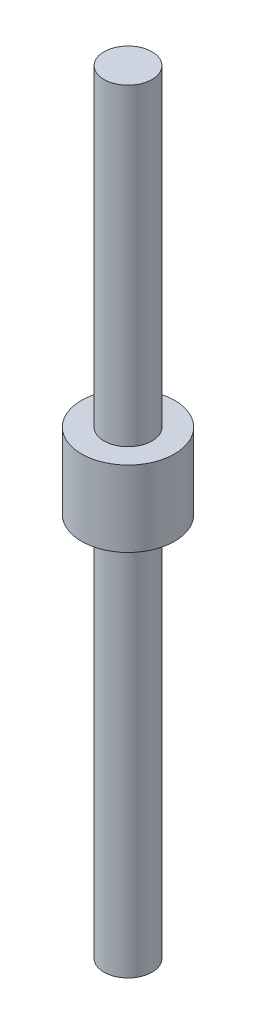
ISO-10303-21;
HEADER;
FILE_DESCRIPTION(('STEP AP214'),'2;1');
FILE_NAME('part.step','',(''),(''),'','','');
FILE_SCHEMA(('AUTOMOTIVE_DESIGN { 1 0 10303 214 1 1 1 1 }'));
ENDSEC;
DATA;
#1=APPLICATION_CONTEXT('core data for automotive mechanical design processes');
#2=APPLICATION_PROTOCOL_DEFINITION('international standard','automotive_design',2000,#1);
#3=PRODUCT_CONTEXT('',#1,'mechanical');
#4=PRODUCT('Part','Part','',(#3));
#5=PRODUCT_RELATED_PRODUCT_CATEGORY('part','',(#4));
#6=PRODUCT_DEFINITION_FORMATION('','',#4);
#7=PRODUCT_DEFINITION_CONTEXT('part definition',#1,'design');
#8=PRODUCT_DEFINITION('design','',#6,#7);
#9=PRODUCT_DEFINITION_SHAPE('','',#8);
#10=(LENGTH_UNIT() NAMED_UNIT(*) SI_UNIT(.MILLI.,.METRE.));
#11=(NAMED_UNIT(*) PLANE_ANGLE_UNIT() SI_UNIT($,.RADIAN.));
#12=(NAMED_UNIT(*) SI_UNIT($,.STERADIAN.) SOLID_ANGLE_UNIT());
#13=UNCERTAINTY_MEASURE_WITH_UNIT(LENGTH_MEASURE(1.E-05),#10,'distance_accuracy_value','');
#14=(GEOMETRIC_REPRESENTATION_CONTEXT(3) GLOBAL_UNCERTAINTY_ASSIGNED_CONTEXT((#13)) GLOBAL_UNIT_ASSIGNED_CONTEXT((#10,
#11,#12)) REPRESENTATION_CONTEXT('',''));
#15=CARTESIAN_POINT('',(0.,0.,0.));
#16=DIRECTION('',(0.,0.,1.));
#17=DIRECTION('',(1.,0.,0.));
#18=AXIS2_PLACEMENT_3D('',#15,#16,#17);
#19=CARTESIAN_POINT('',(0.,0.,0.));
#20=DIRECTION('',(0.,-1.,0.));
#21=DIRECTION('',(0.,0.,-1.));
#22=AXIS2_PLACEMENT_3D('',#19,#20,#21);
#23=PLANE('',#22);
#24=CARTESIAN_POINT('',(0.,0.,0.));
#25=DIRECTION('',(0.,-1.,0.));
#26=DIRECTION('',(0.,0.,-1.));
#27=AXIS2_PLACEMENT_3D('',#24,#25,#26);
#28=CIRCLE('',#27,3.175);
#29=CARTESIAN_POINT('',(0.,0.,-3.175));
#30=VERTEX_POINT('',#29);
#31=EDGE_CURVE('E10',#30,#30,#28,.T.);
#32=ORIENTED_EDGE('',*,*,#31,.T.);
#33=EDGE_LOOP('',(#32));
#34=FACE_BOUND('',#33,.T.);
#35=ADVANCED_FACE('F31',(#34),#23,.T.);
#36=CARTESIAN_POINT('',(0.,0.,0.));
#37=DIRECTION('',(0.,-1.,0.));
#38=DIRECTION('',(0.,0.,-1.));
#39=AXIS2_PLACEMENT_3D('',#36,#37,#38);
#40=CYLINDRICAL_SURFACE('',#39,3.175);
#41=CARTESIAN_POINT('',(0.,50.8,0.));
#42=DIRECTION('',(0.,-1.,0.));
#43=DIRECTION('',(0.,0.,-1.));
#44=AXIS2_PLACEMENT_3D('',#41,#42,#43);
#45=CIRCLE('',#44,3.175);
#46=CARTESIAN_POINT('',(0.,50.8,-3.175));
#47=VERTEX_POINT('',#46);
#48=EDGE_CURVE('E37',#47,#47,#45,.T.);
#49=ORIENTED_EDGE('',*,*,#48,.T.);
#50=EDGE_LOOP('',(#49));
#51=FACE_BOUND('',#50,.T.);
#52=ORIENTED_EDGE('',*,*,#31,.F.);
#53=EDGE_LOOP('',(#52));
#54=FACE_BOUND('',#53,.T.);
#55=ADVANCED_FACE('F69',(#51,#54),#40,.T.);
#56=CARTESIAN_POINT('',(3.175,50.8,0.));
#57=DIRECTION('',(0.,-1.,0.));
#58=DIRECTION('',(0.,0.,-1.));
#59=AXIS2_PLACEMENT_3D('',#56,#57,#58);
#60=PLANE('',#59);
#61=CARTESIAN_POINT('',(0.,50.8,0.));
#62=DIRECTION('',(0.,-1.,0.));
#63=DIRECTION('',(0.,0.,-1.));
#64=AXIS2_PLACEMENT_3D('',#61,#62,#63);
#65=CIRCLE('',#64,6.1451612903226);
#66=CARTESIAN_POINT('',(0.,50.8,-6.1451612903226));
#67=VERTEX_POINT('',#66);
#68=EDGE_CURVE('E41',#67,#67,#65,.T.);
#69=ORIENTED_EDGE('',*,*,#68,.T.);
#70=EDGE_LOOP('',(#69));
#71=FACE_BOUND('',#70,.T.);
#72=ORIENTED_EDGE('',*,*,#48,.F.);
#73=EDGE_LOOP('',(#72));
#74=FACE_BOUND('',#73,.T.);
#75=ADVANCED_FACE('F73',(#71,#74),#60,.T.);
#76=CARTESIAN_POINT('',(0.,0.,0.));
#77=DIRECTION('',(0.,-1.,0.));
#78=DIRECTION('',(0.,0.,-1.));
#79=AXIS2_PLACEMENT_3D('',#76,#77,#78);
#80=CYLINDRICAL_SURFACE('',#79,6.1451612903226);
#81=CARTESIAN_POINT('',(0.,60.8085185067466,0.));
#82=DIRECTION('',(0.,-1.,0.));
#83=DIRECTION('',(0.,0.,-1.));
#84=AXIS2_PLACEMENT_3D('',#81,#82,#83);
#85=CIRCLE('',#84,6.1451612903226);
#86=CARTESIAN_POINT('',(0.,60.8085185067466,-6.1451612903226));
#87=VERTEX_POINT('',#86);
#88=EDGE_CURVE('E45',#87,#87,#85,.T.);
#89=ORIENTED_EDGE('',*,*,#88,.T.);
#90=EDGE_LOOP('',(#89));
#91=FACE_BOUND('',#90,.T.);
#92=ORIENTED_EDGE('',*,*,#68,.F.);
#93=EDGE_LOOP('',(#92));
#94=FACE_BOUND('',#93,.T.);
#95=ADVANCED_FACE('F77',(#91,#94),#80,.T.);
#96=CARTESIAN_POINT('',(3.175,60.8085185067466,0.));
#97=DIRECTION('',(0.,1.,0.));
#98=DIRECTION('',(0.,0.,1.));
#99=AXIS2_PLACEMENT_3D('',#96,#97,#98);
#100=PLANE('',#99);
#101=CARTESIAN_POINT('',(0.,60.8085185067466,0.));
#102=DIRECTION('',(0.,-1.,0.));
#103=DIRECTION('',(0.,0.,-1.));
#104=AXIS2_PLACEMENT_3D('',#101,#102,#103);
#105=CIRCLE('',#104,3.175);
#106=CARTESIAN_POINT('',(0.,60.8085185067466,-3.175));
#107=VERTEX_POINT('',#106);
#108=EDGE_CURVE('E50',#107,#107,#105,.T.);
#109=ORIENTED_EDGE('',*,*,#108,.T.);
#110=EDGE_LOOP('',(#109));
#111=FACE_BOUND('',#110,.T.);
#112=ORIENTED_EDGE('',*,*,#88,.F.);
#113=EDGE_LOOP('',(#112));
#114=FACE_BOUND('',#113,.T.);
#115=ADVANCED_FACE('F66',(#111,#114),#100,.T.);
#116=CARTESIAN_POINT('',(0.,0.,0.));
#117=DIRECTION('',(0.,-1.,0.));
#118=DIRECTION('',(0.,0.,-1.));
#119=AXIS2_PLACEMENT_3D('',#116,#117,#118);
#120=CYLINDRICAL_SURFACE('',#119,3.175);
#121=CARTESIAN_POINT('',(0.,102.187397156399,0.));
#122=DIRECTION('',(0.,-1.,0.));
#123=DIRECTION('',(0.,0.,-1.));
#124=AXIS2_PLACEMENT_3D('',#121,#122,#123);
#125=CIRCLE('',#124,3.175);
#126=CARTESIAN_POINT('',(0.,102.187397156399,-3.175));
#127=VERTEX_POINT('',#126);
#128=EDGE_CURVE('E53',#127,#127,#125,.T.);
#129=ORIENTED_EDGE('',*,*,#128,.T.);
#130=EDGE_LOOP('',(#129));
#131=FACE_BOUND('',#130,.T.);
#132=ORIENTED_EDGE('',*,*,#108,.F.);
#133=EDGE_LOOP('',(#132));
#134=FACE_BOUND('',#133,.T.);
#135=ADVANCED_FACE('F57',(#131,#134),#120,.T.);
#136=CARTESIAN_POINT('',(3.175,102.187397156399,0.));
#137=DIRECTION('',(0.,1.,0.));
#138=DIRECTION('',(0.,0.,1.));
#139=AXIS2_PLACEMENT_3D('',#136,#137,#138);
#140=PLANE('',#139);
#141=ORIENTED_EDGE('',*,*,#128,.F.);
#142=EDGE_LOOP('',(#141));
#143=FACE_BOUND('',#142,.T.);
#144=ADVANCED_FACE('F60',(#143),#140,.T.);
#145=CLOSED_SHELL('',(#35,#55,#75,#95,#115,#135,#144));
#146=MANIFOLD_SOLID_BREP('B2',#145);
#147=ADVANCED_BREP_SHAPE_REPRESENTATION('',(#18,#146),#14);
#148=SHAPE_DEFINITION_REPRESENTATION(#9,#147);
ENDSEC;
END-ISO-10303-21;
